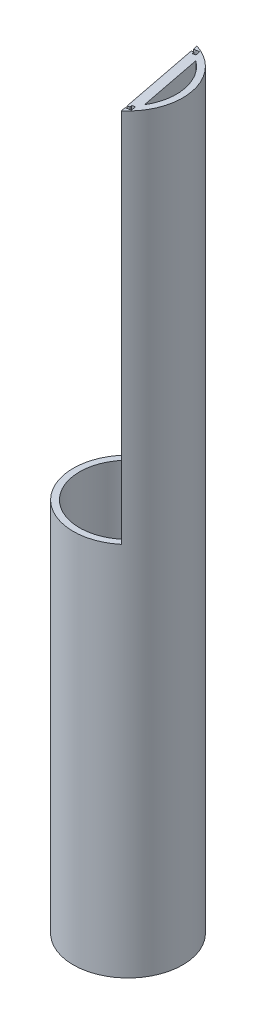
ISO-10303-21;
HEADER;
FILE_DESCRIPTION(('STEP AP214'),'2;1');
FILE_NAME('part.step','',(''),(''),'','','');
FILE_SCHEMA(('AUTOMOTIVE_DESIGN { 1 0 10303 214 1 1 1 1 }'));
ENDSEC;
DATA;
#1=APPLICATION_CONTEXT('core data for automotive mechanical design processes');
#2=APPLICATION_PROTOCOL_DEFINITION('international standard','automotive_design',2000,#1);
#3=PRODUCT_CONTEXT('',#1,'mechanical');
#4=PRODUCT('Part','Part','',(#3));
#5=PRODUCT_RELATED_PRODUCT_CATEGORY('part','',(#4));
#6=PRODUCT_DEFINITION_FORMATION('','',#4);
#7=PRODUCT_DEFINITION_CONTEXT('part definition',#1,'design');
#8=PRODUCT_DEFINITION('design','',#6,#7);
#9=PRODUCT_DEFINITION_SHAPE('','',#8);
#10=(LENGTH_UNIT() NAMED_UNIT(*) SI_UNIT(.MILLI.,.METRE.));
#11=(NAMED_UNIT(*) PLANE_ANGLE_UNIT() SI_UNIT($,.RADIAN.));
#12=(NAMED_UNIT(*) SI_UNIT($,.STERADIAN.) SOLID_ANGLE_UNIT());
#13=UNCERTAINTY_MEASURE_WITH_UNIT(LENGTH_MEASURE(1.E-05),#10,'distance_accuracy_value','');
#14=(GEOMETRIC_REPRESENTATION_CONTEXT(3) GLOBAL_UNCERTAINTY_ASSIGNED_CONTEXT((#13)) GLOBAL_UNIT_ASSIGNED_CONTEXT((#10,
#11,#12)) REPRESENTATION_CONTEXT('',''));
#15=CARTESIAN_POINT('',(0.,0.,0.));
#16=DIRECTION('',(0.,0.,1.));
#17=DIRECTION('',(1.,0.,0.));
#18=AXIS2_PLACEMENT_3D('',#15,#16,#17);
#19=CARTESIAN_POINT('',(0.,240.,0.));
#20=DIRECTION('',(0.,1.,0.));
#21=DIRECTION('',(0.,0.,1.));
#22=AXIS2_PLACEMENT_3D('',#19,#20,#21);
#23=PLANE('',#22);
#24=DIRECTION('',(0.192781226726565,0.,0.981241763594376));
#25=VECTOR('',#24,1.);
#26=CARTESIAN_POINT('',(6.45734730003524,240.,-15.3144333779034));
#27=LINE('',#26,#25);
#28=CARTESIAN_POINT('',(6.61843109051543,240.,-14.4945291510181));
#29=VERTEX_POINT('',#28);
#30=CARTESIAN_POINT('',(6.7580965239566,240.,-13.7836427304364));
#31=VERTEX_POINT('',#30);
#32=EDGE_CURVE('E189',#29,#31,#27,.T.);
#33=ORIENTED_EDGE('',*,*,#32,.F.);
#34=DIRECTION('',(-0.981547063544028,0.,0.191220715530758));
#35=VECTOR('',#34,1.);
#36=CARTESIAN_POINT('',(6.84619335663057,240.,-14.5389008017672));
#37=LINE('',#36,#35);
#38=CARTESIAN_POINT('',(5.86464629308654,240.,-14.3476800862365));
#39=VERTEX_POINT('',#38);
#40=EDGE_CURVE('E267',#29,#39,#37,.T.);
#41=ORIENTED_EDGE('',*,*,#40,.T.);
#42=DIRECTION('',(0.191220715530758,0.,0.981547063544028));
#43=VECTOR('',#42,1.);
#44=CARTESIAN_POINT('',(5.41803556044072,240.,-16.6401589735735));
#45=LINE('',#44,#43);
#46=CARTESIAN_POINT('',(10.821653787162,240.,11.0969279222136));
#47=VERTEX_POINT('',#46);
#48=EDGE_CURVE('E312',#39,#47,#45,.T.);
#49=ORIENTED_EDGE('',*,*,#48,.T.);
#50=DIRECTION('',(-0.981547063544028,0.,0.191220715530758));
#51=VECTOR('',#50,1.);
#52=CARTESIAN_POINT('',(11.803200850706,240.,10.9057072066828));
#53=LINE('',#52,#51);
#54=CARTESIAN_POINT('',(11.5754385845909,240.,10.950078857432));
#55=VERTEX_POINT('',#54);
#56=EDGE_CURVE('E286',#55,#47,#53,.T.);
#57=ORIENTED_EDGE('',*,*,#56,.F.);
#58=DIRECTION('',(-0.189659720851879,0.,-0.981849881746893));
#59=VECTOR('',#58,1.);
#60=CARTESIAN_POINT('',(11.7339141128101,240.,11.7704912145888));
#61=LINE('',#60,#59);
#62=CARTESIAN_POINT('',(11.4380346082345,240.,10.2387518696499));
#63=VERTEX_POINT('',#62);
#64=EDGE_CURVE('E234',#55,#63,#61,.T.);
#65=ORIENTED_EDGE('',*,*,#64,.T.);
#66=DIRECTION('',(0.981547063544027,0.,-0.191220715530763));
#67=VECTOR('',#66,1.);
#68=CARTESIAN_POINT('',(11.4380346082345,240.,10.2387518696499));
#69=LINE('',#68,#67);
#70=CARTESIAN_POINT('',(12.4195751950816,240.,10.047532415881));
#71=VERTEX_POINT('',#70);
#72=EDGE_CURVE('E213',#63,#71,#69,.T.);
#73=ORIENTED_EDGE('',*,*,#72,.T.);
#74=DIRECTION('',(0.189659720851879,0.,0.981849881746893));
#75=VECTOR('',#74,1.);
#76=CARTESIAN_POINT('',(12.4195751950816,240.,10.047532415881));
#77=LINE('',#76,#75);
#78=CARTESIAN_POINT('',(12.715756274614,240.,11.5808329849651));
#79=VERTEX_POINT('',#78);
#80=EDGE_CURVE('E241',#71,#79,#77,.T.);
#81=ORIENTED_EDGE('',*,*,#80,.T.);
#82=DIRECTION('',(-0.981849881746893,0.,0.189659720851878));
#83=VECTOR('',#82,1.);
#84=CARTESIAN_POINT('',(12.715756274614,240.,11.5808329849651));
#85=LINE('',#84,#83);
#86=CARTESIAN_POINT('',(11.7339141128101,240.,11.7704912145888));
#87=VERTEX_POINT('',#86);
#88=EDGE_CURVE('E237',#79,#87,#85,.T.);
#89=ORIENTED_EDGE('',*,*,#88,.T.);
#90=DIRECTION('',(-0.981547063544028,0.,0.191220715530758));
#91=VECTOR('',#90,1.);
#92=CARTESIAN_POINT('',(11.9629805100557,240.,11.7258654987039));
#93=LINE('',#92,#91);
#94=CARTESIAN_POINT('',(10.9814334465116,240.,11.9170862142346));
#95=VERTEX_POINT('',#94);
#96=EDGE_CURVE('E282',#87,#95,#93,.T.);
#97=ORIENTED_EDGE('',*,*,#96,.T.);
#98=CARTESIAN_POINT('',(11.2682645198078,240.,13.3894068095507));
#99=VERTEX_POINT('',#98);
#100=EDGE_CURVE('E306',#95,#99,#45,.T.);
#101=ORIENTED_EDGE('',*,*,#100,.T.);
#102=CARTESIAN_POINT('',(0.,240.,0.));
#103=DIRECTION('',(0.,1.,0.));
#104=DIRECTION('',(0.,0.,1.));
#105=AXIS2_PLACEMENT_3D('',#102,#103,#104);
#106=CIRCLE('',#105,17.5);
#107=CARTESIAN_POINT('',(5.41803556044072,240.,-16.6401589735735));
#108=VERTEX_POINT('',#107);
#109=EDGE_CURVE('E303',#99,#108,#106,.T.);
#110=ORIENTED_EDGE('',*,*,#109,.T.);
#111=CARTESIAN_POINT('',(5.70486663373685,240.,-15.1678383782575));
#112=VERTEX_POINT('',#111);
#113=EDGE_CURVE('E308',#108,#112,#45,.T.);
#114=ORIENTED_EDGE('',*,*,#113,.T.);
#115=DIRECTION('',(-0.981547063544028,0.,0.191220715530758));
#116=VECTOR('',#115,1.);
#117=CARTESIAN_POINT('',(6.68641369728088,240.,-15.3590590937883));
#118=LINE('',#117,#116);
#119=CARTESIAN_POINT('',(6.45734730003524,240.,-15.3144333779034));
#120=VERTEX_POINT('',#119);
#121=EDGE_CURVE('E274',#120,#112,#118,.T.);
#122=ORIENTED_EDGE('',*,*,#121,.F.);
#123=DIRECTION('',(-0.981241763594376,0.,0.192781226726566));
#124=VECTOR('',#123,1.);
#125=CARTESIAN_POINT('',(7.43858134846798,240.,-15.5072130888584));
#126=LINE('',#125,#124);
#127=CARTESIAN_POINT('',(7.43858134846798,240.,-15.5072130888584));
#128=VERTEX_POINT('',#127);
#129=EDGE_CURVE('E215',#128,#120,#126,.T.);
#130=ORIENTED_EDGE('',*,*,#129,.F.);
#131=DIRECTION('',(-0.192781226726565,0.,-0.981241763594376));
#132=VECTOR('',#131,1.);
#133=CARTESIAN_POINT('',(7.73963711080373,240.,-13.9748621842054));
#134=LINE('',#133,#132);
#135=CARTESIAN_POINT('',(7.73963711080373,240.,-13.9748621842054));
#136=VERTEX_POINT('',#135);
#137=EDGE_CURVE('E212',#136,#128,#134,.T.);
#138=ORIENTED_EDGE('',*,*,#137,.F.);
#139=DIRECTION('',(0.981547063544028,0.,-0.191220715530759));
#140=VECTOR('',#139,1.);
#141=CARTESIAN_POINT('',(6.7580965239566,240.,-13.7836427304364));
#142=LINE('',#141,#140);
#143=EDGE_CURVE('E195',#31,#136,#142,.T.);
#144=ORIENTED_EDGE('',*,*,#143,.F.);
#145=EDGE_LOOP('',(#33,#41,#49,#57,#65,#73,#81,#89,#97,#101,#110,#114,#122,#130,#138,#144));
#146=FACE_BOUND('',#145,.T.);
#147=DIRECTION('',(0.191220715530758,0.,0.981547063544028));
#148=VECTOR('',#147,1.);
#149=CARTESIAN_POINT('',(9.30056726220265,240.,-12.3995745330735));
#150=LINE('',#149,#148);
#151=CARTESIAN_POINT('',(9.30056726220265,240.,-12.3995745330735));
#152=VERTEX_POINT('',#151);
#153=CARTESIAN_POINT('',(13.27501519931,240.,8.00149807586605));
#154=VERTEX_POINT('',#153);
#155=EDGE_CURVE('E292',#152,#154,#150,.T.);
#156=ORIENTED_EDGE('',*,*,#155,.F.);
#157=CARTESIAN_POINT('',(0.,240.,0.));
#158=DIRECTION('',(0.,1.,0.));
#159=DIRECTION('',(0.,0.,1.));
#160=AXIS2_PLACEMENT_3D('',#157,#158,#159);
#161=CIRCLE('',#160,15.5);
#162=EDGE_CURVE('E289',#154,#152,#161,.T.);
#163=ORIENTED_EDGE('',*,*,#162,.F.);
#164=EDGE_LOOP('',(#156,#163));
#165=FACE_BOUND('',#164,.T.);
#166=ADVANCED_FACE('F43',(#146,#165),#23,.T.);
#167=CARTESIAN_POINT('',(0.,120.,0.));
#168=DIRECTION('',(0.,1.,0.));
#169=DIRECTION('',(0.,0.,1.));
#170=AXIS2_PLACEMENT_3D('',#167,#168,#169);
#171=PLANE('',#170);
#172=DIRECTION('',(0.192781226726565,0.,0.981241763594376));
#173=VECTOR('',#172,1.);
#174=CARTESIAN_POINT('',(6.45734730003524,120.,-15.3144333779034));
#175=LINE('',#174,#173);
#176=CARTESIAN_POINT('',(6.72217667586494,120.,-13.9664720218979));
#177=VERTEX_POINT('',#176);
#178=CARTESIAN_POINT('',(6.75809652395659,120.,-13.7836427304364));
#179=VERTEX_POINT('',#178);
#180=EDGE_CURVE('E206',#177,#179,#175,.T.);
#181=ORIENTED_EDGE('',*,*,#180,.T.);
#182=DIRECTION('',(0.981547063544028,0.,-0.191220715530759));
#183=VECTOR('',#182,1.);
#184=CARTESIAN_POINT('',(6.7580965239566,120.,-13.7836427304364));
#185=LINE('',#184,#183);
#186=CARTESIAN_POINT('',(6.99792746550032,120.,-13.8303655478659));
#187=VERTEX_POINT('',#186);
#188=EDGE_CURVE('E58',#179,#187,#185,.T.);
#189=ORIENTED_EDGE('',*,*,#188,.T.);
#190=CARTESIAN_POINT('',(0.,120.,0.));
#191=DIRECTION('',(0.,1.,0.));
#192=DIRECTION('',(0.,0.,1.));
#193=AXIS2_PLACEMENT_3D('',#190,#191,#192);
#194=CIRCLE('',#193,15.5);
#195=CARTESIAN_POINT('',(9.30056726220265,120.,-12.3995745330735));
#196=VERTEX_POINT('',#195);
#197=EDGE_CURVE('E327',#196,#187,#194,.T.);
#198=ORIENTED_EDGE('',*,*,#197,.F.);
#199=DIRECTION('',(0.191220715530758,0.,0.981547063544028));
#200=VECTOR('',#199,1.);
#201=CARTESIAN_POINT('',(9.30056726220265,120.,-12.3995745330735));
#202=LINE('',#201,#200);
#203=CARTESIAN_POINT('',(13.27501519931,120.,8.00149807586605));
#204=VERTEX_POINT('',#203);
#205=EDGE_CURVE('E271',#196,#204,#202,.T.);
#206=ORIENTED_EDGE('',*,*,#205,.T.);
#207=CARTESIAN_POINT('',(11.6778655497781,120.,10.1920290522205));
#208=VERTEX_POINT('',#207);
#209=EDGE_CURVE('E325',#208,#204,#194,.T.);
#210=ORIENTED_EDGE('',*,*,#209,.F.);
#211=DIRECTION('',(0.981547063544027,0.,-0.191220715530763));
#212=VECTOR('',#211,1.);
#213=CARTESIAN_POINT('',(11.4380346082345,120.,10.2387518696499));
#214=LINE('',#213,#212);
#215=CARTESIAN_POINT('',(11.4380346082345,120.,10.2387518696499));
#216=VERTEX_POINT('',#215);
#217=EDGE_CURVE('E238',#216,#208,#214,.T.);
#218=ORIENTED_EDGE('',*,*,#217,.F.);
#219=DIRECTION('',(-0.189659720851879,0.,-0.981849881746893));
#220=VECTOR('',#219,1.);
#221=CARTESIAN_POINT('',(11.7339141128101,120.,11.7704912145888));
#222=LINE('',#221,#220);
#223=CARTESIAN_POINT('',(11.4733728435895,120.,10.4216944683666));
#224=VERTEX_POINT('',#223);
#225=EDGE_CURVE('E233',#224,#216,#222,.T.);
#226=ORIENTED_EDGE('',*,*,#225,.F.);
#227=CARTESIAN_POINT('',(10.821653787162,120.,11.0969279222136));
#228=VERTEX_POINT('',#227);
#229=EDGE_CURVE('E321',#228,#224,#194,.T.);
#230=ORIENTED_EDGE('',*,*,#229,.F.);
#231=DIRECTION('',(0.191220715530758,0.,0.981547063544028));
#232=VECTOR('',#231,1.);
#233=CARTESIAN_POINT('',(5.41803556044072,120.,-16.6401589735735));
#234=LINE('',#233,#232);
#235=CARTESIAN_POINT('',(5.86464629308654,120.,-14.3476800862365));
#236=VERTEX_POINT('',#235);
#237=EDGE_CURVE('E302',#236,#228,#234,.T.);
#238=ORIENTED_EDGE('',*,*,#237,.F.);
#239=EDGE_CURVE('E326',#177,#236,#194,.T.);
#240=ORIENTED_EDGE('',*,*,#239,.F.);
#241=EDGE_LOOP('',(#181,#189,#198,#206,#210,#218,#226,#230,#238,#240));
#242=FACE_BOUND('',#241,.T.);
#243=ADVANCED_FACE('F359',(#242),#171,.F.);
#244=CARTESIAN_POINT('',(11.9629805100557,0.,11.7258654987039));
#245=DIRECTION('',(-0.191220715530758,0.,-0.981547063544028));
#246=DIRECTION('',(-0.981547063544028,0.,0.191220715530758));
#247=AXIS2_PLACEMENT_3D('',#244,#245,#246);
#248=PLANE('',#247);
#249=ORIENTED_EDGE('',*,*,#96,.F.);
#250=DIRECTION('',(0.,1.,0.));
#251=VECTOR('',#250,1.);
#252=CARTESIAN_POINT('',(11.7339141128101,120.,11.7704912145888));
#253=LINE('',#252,#251);
#254=CARTESIAN_POINT('',(11.7339141128101,120.,11.7704912145888));
#255=VERTEX_POINT('',#254);
#256=EDGE_CURVE('E229',#255,#87,#253,.T.);
#257=ORIENTED_EDGE('',*,*,#256,.F.);
#258=DIRECTION('',(-0.981547063544028,0.,0.191220715530758));
#259=VECTOR('',#258,1.);
#260=CARTESIAN_POINT('',(11.9629805100557,120.,11.7258654987039));
#261=LINE('',#260,#259);
#262=CARTESIAN_POINT('',(10.9814334465116,120.,11.9170862142346));
#263=VERTEX_POINT('',#262);
#264=EDGE_CURVE('E264',#255,#263,#261,.T.);
#265=ORIENTED_EDGE('',*,*,#264,.T.);
#266=DIRECTION('',(0.,-1.,0.));
#267=VECTOR('',#266,1.);
#268=CARTESIAN_POINT('',(10.9814334465116,0.,11.9170862142347));
#269=LINE('',#268,#267);
#270=EDGE_CURVE('E259',#95,#263,#269,.T.);
#271=ORIENTED_EDGE('',*,*,#270,.F.);
#272=EDGE_LOOP('',(#249,#257,#265,#271));
#273=FACE_BOUND('',#272,.T.);
#274=ADVANCED_FACE('F365',(#273),#248,.T.);
#275=CARTESIAN_POINT('',(11.803200850706,0.,10.9057072066828));
#276=DIRECTION('',(-0.191220715530758,0.,-0.981547063544028));
#277=DIRECTION('',(-0.981547063544028,0.,0.191220715530758));
#278=AXIS2_PLACEMENT_3D('',#275,#276,#277);
#279=PLANE('',#278);
#280=DIRECTION('',(0.,-1.,0.));
#281=VECTOR('',#280,1.);
#282=CARTESIAN_POINT('',(11.5754385845909,0.,10.950078857432));
#283=LINE('',#282,#281);
#284=CARTESIAN_POINT('',(11.5754385845909,120.,10.950078857432));
#285=VERTEX_POINT('',#284);
#286=EDGE_CURVE('E11',#55,#285,#283,.T.);
#287=ORIENTED_EDGE('',*,*,#286,.F.);
#288=ORIENTED_EDGE('',*,*,#56,.T.);
#289=DIRECTION('',(0.,-1.,0.));
#290=VECTOR('',#289,1.);
#291=CARTESIAN_POINT('',(10.821653787162,0.,11.0969279222136));
#292=LINE('',#291,#290);
#293=EDGE_CURVE('E279',#47,#228,#292,.T.);
#294=ORIENTED_EDGE('',*,*,#293,.T.);
#295=DIRECTION('',(-0.981547063544028,0.,0.191220715530758));
#296=VECTOR('',#295,1.);
#297=CARTESIAN_POINT('',(11.803200850706,120.,10.9057072066828));
#298=LINE('',#297,#296);
#299=EDGE_CURVE('E284',#285,#228,#298,.T.);
#300=ORIENTED_EDGE('',*,*,#299,.F.);
#301=EDGE_LOOP('',(#287,#288,#294,#300));
#302=FACE_BOUND('',#301,.T.);
#303=ADVANCED_FACE('F377',(#302),#279,.F.);
#304=CARTESIAN_POINT('',(5.41803556044072,240.,-16.6401589735735));
#305=DIRECTION('',(0.981547063544028,0.,-0.191220715530758));
#306=DIRECTION('',(-0.191220715530758,0.,-0.981547063544029));
#307=AXIS2_PLACEMENT_3D('',#304,#305,#306);
#308=PLANE('',#307);
#309=DIRECTION('',(0.,-1.,0.));
#310=VECTOR('',#309,1.);
#311=CARTESIAN_POINT('',(5.86464629308654,0.,-14.3476800862365));
#312=LINE('',#311,#310);
#313=EDGE_CURVE('E260',#39,#236,#312,.T.);
#314=ORIENTED_EDGE('',*,*,#313,.T.);
#315=ORIENTED_EDGE('',*,*,#237,.T.);
#316=ORIENTED_EDGE('',*,*,#293,.F.);
#317=ORIENTED_EDGE('',*,*,#48,.F.);
#318=EDGE_LOOP('',(#314,#315,#316,#317));
#319=FACE_BOUND('',#318,.T.);
#320=ADVANCED_FACE('F354',(#319),#308,.F.);
#321=ORIENTED_EDGE('',*,*,#270,.T.);
#322=CARTESIAN_POINT('',(11.2682645198078,120.,13.3894068095507));
#323=VERTEX_POINT('',#322);
#324=EDGE_CURVE('E51',#263,#323,#234,.T.);
#325=ORIENTED_EDGE('',*,*,#324,.T.);
#326=DIRECTION('',(0.,-1.,0.));
#327=VECTOR('',#326,1.);
#328=CARTESIAN_POINT('',(11.2682645198078,240.,13.3894068095507));
#329=LINE('',#328,#327);
#330=EDGE_CURVE('E311',#99,#323,#329,.T.);
#331=ORIENTED_EDGE('',*,*,#330,.F.);
#332=ORIENTED_EDGE('',*,*,#100,.F.);
#333=EDGE_LOOP('',(#321,#325,#331,#332));
#334=FACE_BOUND('',#333,.T.);
#335=ADVANCED_FACE('F355',(#334),#308,.F.);
#336=CARTESIAN_POINT('',(0.,120.,0.));
#337=DIRECTION('',(0.,1.,0.));
#338=DIRECTION('',(0.,0.,1.));
#339=AXIS2_PLACEMENT_3D('',#336,#337,#338);
#340=PLANE('',#339);
#341=EDGE_CURVE('E65',#285,#224,#222,.T.);
#342=ORIENTED_EDGE('',*,*,#341,.F.);
#343=ORIENTED_EDGE('',*,*,#299,.T.);
#344=EDGE_CURVE('E330',#236,#228,#194,.T.);
#345=ORIENTED_EDGE('',*,*,#344,.F.);
#346=DIRECTION('',(-0.981547063544028,0.,0.191220715530758));
#347=VECTOR('',#346,1.);
#348=CARTESIAN_POINT('',(6.84619335663057,120.,-14.5389008017672));
#349=LINE('',#348,#347);
#350=CARTESIAN_POINT('',(6.61843109051543,120.,-14.4945291510181));
#351=VERTEX_POINT('',#350);
#352=EDGE_CURVE('E268',#351,#236,#349,.T.);
#353=ORIENTED_EDGE('',*,*,#352,.F.);
#354=EDGE_CURVE('E200',#351,#177,#175,.T.);
#355=ORIENTED_EDGE('',*,*,#354,.T.);
#356=CARTESIAN_POINT('',(0.,120.,0.));
#357=DIRECTION('',(0.,1.,0.));
#358=DIRECTION('',(0.,0.,1.));
#359=AXIS2_PLACEMENT_3D('',#356,#357,#358);
#360=CIRCLE('',#359,15.5);
#361=EDGE_CURVE('E188',#187,#177,#360,.T.);
#362=ORIENTED_EDGE('',*,*,#361,.F.);
#363=CARTESIAN_POINT('',(7.73963711080373,120.,-13.9748621842054));
#364=VERTEX_POINT('',#363);
#365=EDGE_CURVE('E180',#187,#364,#185,.T.);
#366=ORIENTED_EDGE('',*,*,#365,.T.);
#367=DIRECTION('',(-0.192781226726565,0.,-0.981241763594376));
#368=VECTOR('',#367,1.);
#369=CARTESIAN_POINT('',(7.73963711080373,120.,-13.9748621842054));
#370=LINE('',#369,#368);
#371=CARTESIAN_POINT('',(7.43858134846798,120.,-15.5072130888584));
#372=VERTEX_POINT('',#371);
#373=EDGE_CURVE('E185',#364,#372,#370,.T.);
#374=ORIENTED_EDGE('',*,*,#373,.T.);
#375=DIRECTION('',(-0.981241763594376,0.,0.192781226726566));
#376=VECTOR('',#375,1.);
#377=CARTESIAN_POINT('',(7.43858134846798,120.,-15.5072130888584));
#378=LINE('',#377,#376);
#379=CARTESIAN_POINT('',(6.45734730003524,120.,-15.3144333779034));
#380=VERTEX_POINT('',#379);
#381=EDGE_CURVE('E204',#372,#380,#378,.T.);
#382=ORIENTED_EDGE('',*,*,#381,.T.);
#383=DIRECTION('',(-0.981547063544028,0.,0.191220715530758));
#384=VECTOR('',#383,1.);
#385=CARTESIAN_POINT('',(6.68641369728088,120.,-15.3590590937883));
#386=LINE('',#385,#384);
#387=CARTESIAN_POINT('',(5.70486663373685,120.,-15.1678383782575));
#388=VERTEX_POINT('',#387);
#389=EDGE_CURVE('E272',#380,#388,#386,.T.);
#390=ORIENTED_EDGE('',*,*,#389,.T.);
#391=CARTESIAN_POINT('',(5.41803556044071,120.,-16.6401589735735));
#392=VERTEX_POINT('',#391);
#393=EDGE_CURVE('E307',#392,#388,#234,.T.);
#394=ORIENTED_EDGE('',*,*,#393,.F.);
#395=CARTESIAN_POINT('',(0.,120.,0.));
#396=DIRECTION('',(0.,1.,0.));
#397=DIRECTION('',(0.,0.,1.));
#398=AXIS2_PLACEMENT_3D('',#395,#396,#397);
#399=CIRCLE('',#398,17.5);
#400=EDGE_CURVE('E331',#392,#323,#399,.T.);
#401=ORIENTED_EDGE('',*,*,#400,.T.);
#402=ORIENTED_EDGE('',*,*,#324,.F.);
#403=ORIENTED_EDGE('',*,*,#264,.F.);
#404=DIRECTION('',(-0.981849881746893,0.,0.189659720851878));
#405=VECTOR('',#404,1.);
#406=CARTESIAN_POINT('',(12.715756274614,120.,11.5808329849651));
#407=LINE('',#406,#405);
#408=CARTESIAN_POINT('',(12.715756274614,120.,11.5808329849651));
#409=VERTEX_POINT('',#408);
#410=EDGE_CURVE('E247',#409,#255,#407,.T.);
#411=ORIENTED_EDGE('',*,*,#410,.F.);
#412=DIRECTION('',(0.189659720851879,0.,0.981849881746893));
#413=VECTOR('',#412,1.);
#414=CARTESIAN_POINT('',(12.4195751950816,120.,10.047532415881));
#415=LINE('',#414,#413);
#416=CARTESIAN_POINT('',(12.4195751950816,120.,10.047532415881));
#417=VERTEX_POINT('',#416);
#418=EDGE_CURVE('E249',#417,#409,#415,.T.);
#419=ORIENTED_EDGE('',*,*,#418,.F.);
#420=EDGE_CURVE('E251',#208,#417,#214,.T.);
#421=ORIENTED_EDGE('',*,*,#420,.F.);
#422=CARTESIAN_POINT('',(0.,120.,0.));
#423=DIRECTION('',(0.,-1.,0.));
#424=DIRECTION('',(0.,0.,-1.));
#425=AXIS2_PLACEMENT_3D('',#422,#423,#424);
#426=CIRCLE('',#425,15.5);
#427=EDGE_CURVE('E257',#208,#224,#426,.T.);
#428=ORIENTED_EDGE('',*,*,#427,.T.);
#429=EDGE_LOOP('',(#342,#343,#345,#353,#355,#362,#366,#374,#382,#390,#394,#401,#402,#403,#411,
#419,#421,#428));
#430=FACE_BOUND('',#429,.T.);
#431=ADVANCED_FACE('F182',(#430),#340,.T.);
#432=CARTESIAN_POINT('',(0.,0.,0.));
#433=DIRECTION('',(0.,1.,0.));
#434=DIRECTION('',(0.,0.,1.));
#435=AXIS2_PLACEMENT_3D('',#432,#433,#434);
#436=PLANE('',#435);
#437=CARTESIAN_POINT('',(0.,0.,0.));
#438=DIRECTION('',(0.,1.,0.));
#439=DIRECTION('',(0.,0.,1.));
#440=AXIS2_PLACEMENT_3D('',#437,#438,#439);
#441=CIRCLE('',#440,17.5);
#442=CARTESIAN_POINT('',(0.,0.,17.5));
#443=VERTEX_POINT('',#442);
#444=EDGE_CURVE('E324',#443,#443,#441,.T.);
#445=ORIENTED_EDGE('',*,*,#444,.F.);
#446=EDGE_LOOP('',(#445));
#447=FACE_BOUND('',#446,.T.);
#448=CARTESIAN_POINT('',(0.,0.,0.));
#449=DIRECTION('',(0.,1.,0.));
#450=DIRECTION('',(0.,0.,1.));
#451=AXIS2_PLACEMENT_3D('',#448,#449,#450);
#452=CIRCLE('',#451,15.5);
#453=CARTESIAN_POINT('',(0.,0.,15.5));
#454=VERTEX_POINT('',#453);
#455=EDGE_CURVE('E320',#454,#454,#452,.T.);
#456=ORIENTED_EDGE('',*,*,#455,.T.);
#457=EDGE_LOOP('',(#456));
#458=FACE_BOUND('',#457,.T.);
#459=ADVANCED_FACE('F337',(#447,#458),#436,.F.);
#460=CARTESIAN_POINT('',(0.,120.,0.));
#461=DIRECTION('',(0.,-1.,0.));
#462=DIRECTION('',(0.,0.,-1.));
#463=AXIS2_PLACEMENT_3D('',#460,#461,#462);
#464=CYLINDRICAL_SURFACE('',#463,17.5);
#465=ORIENTED_EDGE('',*,*,#400,.F.);
#466=DIRECTION('',(0.,-1.,0.));
#467=VECTOR('',#466,1.);
#468=CARTESIAN_POINT('',(5.41803556044072,240.,-16.6401589735735));
#469=LINE('',#468,#467);
#470=EDGE_CURVE('E317',#108,#392,#469,.T.);
#471=ORIENTED_EDGE('',*,*,#470,.F.);
#472=ORIENTED_EDGE('',*,*,#109,.F.);
#473=ORIENTED_EDGE('',*,*,#330,.T.);
#474=EDGE_LOOP('',(#465,#471,#472,#473));
#475=FACE_BOUND('',#474,.T.);
#476=ORIENTED_EDGE('',*,*,#444,.T.);
#477=EDGE_LOOP('',(#476));
#478=FACE_BOUND('',#477,.T.);
#479=ADVANCED_FACE('F45',(#475,#478),#464,.T.);
#480=CARTESIAN_POINT('',(0.,120.,0.));
#481=DIRECTION('',(0.,-1.,0.));
#482=DIRECTION('',(0.,0.,-1.));
#483=AXIS2_PLACEMENT_3D('',#480,#481,#482);
#484=CYLINDRICAL_SURFACE('',#483,15.5);
#485=ORIENTED_EDGE('',*,*,#229,.T.);
#486=ORIENTED_EDGE('',*,*,#427,.F.);
#487=ORIENTED_EDGE('',*,*,#209,.T.);
#488=DIRECTION('',(0.,-1.,0.));
#489=VECTOR('',#488,1.);
#490=CARTESIAN_POINT('',(13.27501519931,240.,8.00149807586605));
#491=LINE('',#490,#489);
#492=EDGE_CURVE('E294',#154,#204,#491,.T.);
#493=ORIENTED_EDGE('',*,*,#492,.F.);
#494=ORIENTED_EDGE('',*,*,#162,.T.);
#495=DIRECTION('',(0.,-1.,0.));
#496=VECTOR('',#495,1.);
#497=CARTESIAN_POINT('',(9.30056726220265,240.,-12.3995745330735));
#498=LINE('',#497,#496);
#499=EDGE_CURVE('E299',#152,#196,#498,.T.);
#500=ORIENTED_EDGE('',*,*,#499,.T.);
#501=ORIENTED_EDGE('',*,*,#197,.T.);
#502=ORIENTED_EDGE('',*,*,#361,.T.);
#503=ORIENTED_EDGE('',*,*,#239,.T.);
#504=ORIENTED_EDGE('',*,*,#344,.T.);
#505=EDGE_LOOP('',(#485,#486,#487,#493,#494,#500,#501,#502,#503,#504));
#506=FACE_BOUND('',#505,.T.);
#507=ORIENTED_EDGE('',*,*,#455,.F.);
#508=EDGE_LOOP('',(#507));
#509=FACE_BOUND('',#508,.T.);
#510=ADVANCED_FACE('F342',(#506,#509),#484,.F.);
#511=ORIENTED_EDGE('',*,*,#393,.T.);
#512=DIRECTION('',(0.,-1.,0.));
#513=VECTOR('',#512,1.);
#514=CARTESIAN_POINT('',(5.70486663373685,0.,-15.1678383782575));
#515=LINE('',#514,#513);
#516=EDGE_CURVE('E263',#112,#388,#515,.T.);
#517=ORIENTED_EDGE('',*,*,#516,.F.);
#518=ORIENTED_EDGE('',*,*,#113,.F.);
#519=ORIENTED_EDGE('',*,*,#470,.T.);
#520=EDGE_LOOP('',(#511,#517,#518,#519));
#521=FACE_BOUND('',#520,.T.);
#522=ADVANCED_FACE('F344',(#521),#308,.F.);
#523=CARTESIAN_POINT('',(9.30056726220265,240.,-12.3995745330735));
#524=DIRECTION('',(0.981547063544028,0.,-0.191220715530758));
#525=DIRECTION('',(-0.191220715530758,0.,-0.981547063544029));
#526=AXIS2_PLACEMENT_3D('',#523,#524,#525);
#527=PLANE('',#526);
#528=ORIENTED_EDGE('',*,*,#205,.F.);
#529=ORIENTED_EDGE('',*,*,#499,.F.);
#530=ORIENTED_EDGE('',*,*,#155,.T.);
#531=ORIENTED_EDGE('',*,*,#492,.T.);
#532=EDGE_LOOP('',(#528,#529,#530,#531));
#533=FACE_BOUND('',#532,.T.);
#534=ADVANCED_FACE('F351',(#533),#527,.T.);
#535=CARTESIAN_POINT('',(6.84619335663056,0.,-14.5389008017672));
#536=DIRECTION('',(-0.191220715530758,0.,-0.981547063544028));
#537=DIRECTION('',(-0.981547063544028,0.,0.191220715530758));
#538=AXIS2_PLACEMENT_3D('',#535,#536,#537);
#539=PLANE('',#538);
#540=DIRECTION('',(0.,1.,0.));
#541=VECTOR('',#540,1.);
#542=CARTESIAN_POINT('',(6.61843109051543,0.,-14.4945291510181));
#543=LINE('',#542,#541);
#544=EDGE_CURVE('E255',#351,#29,#543,.T.);
#545=ORIENTED_EDGE('',*,*,#544,.F.);
#546=ORIENTED_EDGE('',*,*,#352,.T.);
#547=ORIENTED_EDGE('',*,*,#313,.F.);
#548=ORIENTED_EDGE('',*,*,#40,.F.);
#549=EDGE_LOOP('',(#545,#546,#547,#548));
#550=FACE_BOUND('',#549,.T.);
#551=ADVANCED_FACE('F373',(#550),#539,.T.);
#552=CARTESIAN_POINT('',(6.68641369728088,0.,-15.3590590937882));
#553=DIRECTION('',(-0.191220715530758,0.,-0.981547063544028));
#554=DIRECTION('',(-0.981547063544028,0.,0.191220715530758));
#555=AXIS2_PLACEMENT_3D('',#552,#553,#554);
#556=PLANE('',#555);
#557=ORIENTED_EDGE('',*,*,#389,.F.);
#558=DIRECTION('',(0.,1.,0.));
#559=VECTOR('',#558,1.);
#560=CARTESIAN_POINT('',(6.45734730003524,120.,-15.3144333779034));
#561=LINE('',#560,#559);
#562=EDGE_CURVE('E220',#380,#120,#561,.T.);
#563=ORIENTED_EDGE('',*,*,#562,.T.);
#564=ORIENTED_EDGE('',*,*,#121,.T.);
#565=ORIENTED_EDGE('',*,*,#516,.T.);
#566=EDGE_LOOP('',(#557,#563,#564,#565));
#567=FACE_BOUND('',#566,.T.);
#568=ADVANCED_FACE('F384',(#567),#556,.F.);
#569=CARTESIAN_POINT('',(6.7580965239566,120.,-13.7836427304364));
#570=DIRECTION('',(0.191220715530759,0.,0.981547063544028));
#571=DIRECTION('',(0.981547063544028,0.,-0.191220715530759));
#572=AXIS2_PLACEMENT_3D('',#569,#570,#571);
#573=PLANE('',#572);
#574=ORIENTED_EDGE('',*,*,#143,.T.);
#575=DIRECTION('',(0.,1.,0.));
#576=VECTOR('',#575,1.);
#577=CARTESIAN_POINT('',(7.73963711080373,120.,-13.9748621842054));
#578=LINE('',#577,#576);
#579=EDGE_CURVE('E192',#364,#136,#578,.T.);
#580=ORIENTED_EDGE('',*,*,#579,.F.);
#581=ORIENTED_EDGE('',*,*,#365,.F.);
#582=ORIENTED_EDGE('',*,*,#188,.F.);
#583=DIRECTION('',(0.,1.,0.));
#584=VECTOR('',#583,1.);
#585=CARTESIAN_POINT('',(6.7580965239566,120.,-13.7836427304364));
#586=LINE('',#585,#584);
#587=EDGE_CURVE('E218',#179,#31,#586,.T.);
#588=ORIENTED_EDGE('',*,*,#587,.T.);
#589=EDGE_LOOP('',(#574,#580,#581,#582,#588));
#590=FACE_BOUND('',#589,.T.);
#591=ADVANCED_FACE('F193',(#590),#573,.F.);
#592=CARTESIAN_POINT('',(6.45734730003524,120.,-15.3144333779034));
#593=DIRECTION('',(-0.981241763594376,0.,0.192781226726565));
#594=DIRECTION('',(0.192781226726565,0.,0.981241763594376));
#595=AXIS2_PLACEMENT_3D('',#592,#593,#594);
#596=PLANE('',#595);
#597=ORIENTED_EDGE('',*,*,#544,.T.);
#598=ORIENTED_EDGE('',*,*,#32,.T.);
#599=ORIENTED_EDGE('',*,*,#587,.F.);
#600=ORIENTED_EDGE('',*,*,#180,.F.);
#601=ORIENTED_EDGE('',*,*,#354,.F.);
#602=EDGE_LOOP('',(#597,#598,#599,#600,#601));
#603=FACE_BOUND('',#602,.T.);
#604=ADVANCED_FACE('F406',(#603),#596,.F.);
#605=CARTESIAN_POINT('',(7.43858134846798,120.,-15.5072130888584));
#606=DIRECTION('',(-0.192781226726566,0.,-0.981241763594376));
#607=DIRECTION('',(-0.981241763594376,0.,0.192781226726566));
#608=AXIS2_PLACEMENT_3D('',#605,#606,#607);
#609=PLANE('',#608);
#610=ORIENTED_EDGE('',*,*,#129,.T.);
#611=ORIENTED_EDGE('',*,*,#562,.F.);
#612=ORIENTED_EDGE('',*,*,#381,.F.);
#613=DIRECTION('',(0.,1.,0.));
#614=VECTOR('',#613,1.);
#615=CARTESIAN_POINT('',(7.43858134846798,120.,-15.5072130888584));
#616=LINE('',#615,#614);
#617=EDGE_CURVE('E199',#372,#128,#616,.T.);
#618=ORIENTED_EDGE('',*,*,#617,.T.);
#619=EDGE_LOOP('',(#610,#611,#612,#618));
#620=FACE_BOUND('',#619,.T.);
#621=ADVANCED_FACE('F409',(#620),#609,.F.);
#622=CARTESIAN_POINT('',(7.73963711080373,120.,-13.9748621842054));
#623=DIRECTION('',(0.981241763594376,0.,-0.192781226726565));
#624=DIRECTION('',(-0.192781226726565,0.,-0.981241763594376));
#625=AXIS2_PLACEMENT_3D('',#622,#623,#624);
#626=PLANE('',#625);
#627=ORIENTED_EDGE('',*,*,#137,.T.);
#628=ORIENTED_EDGE('',*,*,#617,.F.);
#629=ORIENTED_EDGE('',*,*,#373,.F.);
#630=ORIENTED_EDGE('',*,*,#579,.T.);
#631=EDGE_LOOP('',(#627,#628,#629,#630));
#632=FACE_BOUND('',#631,.T.);
#633=ADVANCED_FACE('F202',(#632),#626,.F.);
#634=CARTESIAN_POINT('',(11.7339141128101,120.,11.7704912145888));
#635=DIRECTION('',(0.981849881746893,0.,-0.189659720851879));
#636=DIRECTION('',(-0.189659720851879,0.,-0.981849881746893));
#637=AXIS2_PLACEMENT_3D('',#634,#635,#636);
#638=PLANE('',#637);
#639=ORIENTED_EDGE('',*,*,#286,.T.);
#640=ORIENTED_EDGE('',*,*,#341,.T.);
#641=ORIENTED_EDGE('',*,*,#225,.T.);
#642=DIRECTION('',(0.,1.,0.));
#643=VECTOR('',#642,1.);
#644=CARTESIAN_POINT('',(11.4380346082345,120.,10.2387518696499));
#645=LINE('',#644,#643);
#646=EDGE_CURVE('E231',#216,#63,#645,.T.);
#647=ORIENTED_EDGE('',*,*,#646,.T.);
#648=ORIENTED_EDGE('',*,*,#64,.F.);
#649=EDGE_LOOP('',(#639,#640,#641,#647,#648));
#650=FACE_BOUND('',#649,.T.);
#651=ADVANCED_FACE('F389',(#650),#638,.T.);
#652=CARTESIAN_POINT('',(11.4380346082345,120.,10.2387518696499));
#653=DIRECTION('',(0.191220715530763,0.,0.981547063544028));
#654=DIRECTION('',(0.981547063544028,0.,-0.191220715530763));
#655=AXIS2_PLACEMENT_3D('',#652,#653,#654);
#656=PLANE('',#655);
#657=ORIENTED_EDGE('',*,*,#72,.F.);
#658=ORIENTED_EDGE('',*,*,#646,.F.);
#659=ORIENTED_EDGE('',*,*,#217,.T.);
#660=ORIENTED_EDGE('',*,*,#420,.T.);
#661=DIRECTION('',(0.,1.,0.));
#662=VECTOR('',#661,1.);
#663=CARTESIAN_POINT('',(12.4195751950816,120.,10.047532415881));
#664=LINE('',#663,#662);
#665=EDGE_CURVE('E224',#417,#71,#664,.T.);
#666=ORIENTED_EDGE('',*,*,#665,.T.);
#667=EDGE_LOOP('',(#657,#658,#659,#660,#666));
#668=FACE_BOUND('',#667,.T.);
#669=ADVANCED_FACE('F392',(#668),#656,.T.);
#670=CARTESIAN_POINT('',(12.4195751950816,120.,10.047532415881));
#671=DIRECTION('',(-0.981849881746893,0.,0.189659720851879));
#672=DIRECTION('',(0.189659720851879,0.,0.981849881746893));
#673=AXIS2_PLACEMENT_3D('',#670,#671,#672);
#674=PLANE('',#673);
#675=ORIENTED_EDGE('',*,*,#80,.F.);
#676=ORIENTED_EDGE('',*,*,#665,.F.);
#677=ORIENTED_EDGE('',*,*,#418,.T.);
#678=DIRECTION('',(0.,1.,0.));
#679=VECTOR('',#678,1.);
#680=CARTESIAN_POINT('',(12.715756274614,120.,11.5808329849651));
#681=LINE('',#680,#679);
#682=EDGE_CURVE('E227',#409,#79,#681,.T.);
#683=ORIENTED_EDGE('',*,*,#682,.T.);
#684=EDGE_LOOP('',(#675,#676,#677,#683));
#685=FACE_BOUND('',#684,.T.);
#686=ADVANCED_FACE('F396',(#685),#674,.T.);
#687=CARTESIAN_POINT('',(12.715756274614,120.,11.5808329849651));
#688=DIRECTION('',(-0.189659720851878,0.,-0.981849881746893));
#689=DIRECTION('',(-0.981849881746893,0.,0.189659720851878));
#690=AXIS2_PLACEMENT_3D('',#687,#688,#689);
#691=PLANE('',#690);
#692=ORIENTED_EDGE('',*,*,#88,.F.);
#693=ORIENTED_EDGE('',*,*,#682,.F.);
#694=ORIENTED_EDGE('',*,*,#410,.T.);
#695=ORIENTED_EDGE('',*,*,#256,.T.);
#696=EDGE_LOOP('',(#692,#693,#694,#695));
#697=FACE_BOUND('',#696,.T.);
#698=ADVANCED_FACE('F393',(#697),#691,.T.);
#699=CLOSED_SHELL('',(#166,#243,#274,#303,#320,#335,#431,#459,#479,#510,#522,#534,#551,#568,
#591,#604,#621,#633,#651,#669,#686,#698));
#700=MANIFOLD_SOLID_BREP('B2',#699);
#701=ADVANCED_BREP_SHAPE_REPRESENTATION('',(#18,#700),#14);
#702=SHAPE_DEFINITION_REPRESENTATION(#9,#701);
ENDSEC;
END-ISO-10303-21;
